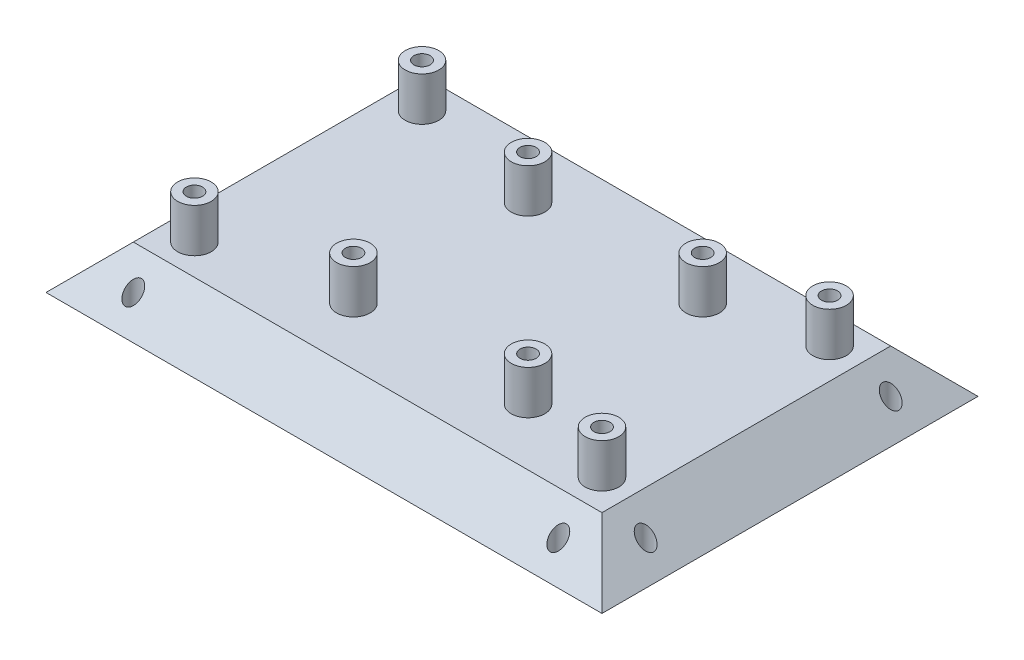
ISO-10303-21;
HEADER;
FILE_DESCRIPTION(('STEP AP214'),'2;1');
FILE_NAME('part.step','',(''),(''),'','','');
FILE_SCHEMA(('AUTOMOTIVE_DESIGN { 1 0 10303 214 1 1 1 1 }'));
ENDSEC;
DATA;
#1=APPLICATION_CONTEXT('core data for automotive mechanical design processes');
#2=APPLICATION_PROTOCOL_DEFINITION('international standard','automotive_design',2000,#1);
#3=PRODUCT_CONTEXT('',#1,'mechanical');
#4=PRODUCT('Part','Part','',(#3));
#5=PRODUCT_RELATED_PRODUCT_CATEGORY('part','',(#4));
#6=PRODUCT_DEFINITION_FORMATION('','',#4);
#7=PRODUCT_DEFINITION_CONTEXT('part definition',#1,'design');
#8=PRODUCT_DEFINITION('design','',#6,#7);
#9=PRODUCT_DEFINITION_SHAPE('','',#8);
#10=(LENGTH_UNIT() NAMED_UNIT(*) SI_UNIT(.MILLI.,.METRE.));
#11=(NAMED_UNIT(*) PLANE_ANGLE_UNIT() SI_UNIT($,.RADIAN.));
#12=(NAMED_UNIT(*) SI_UNIT($,.STERADIAN.) SOLID_ANGLE_UNIT());
#13=UNCERTAINTY_MEASURE_WITH_UNIT(LENGTH_MEASURE(1.E-05),#10,'distance_accuracy_value','');
#14=(GEOMETRIC_REPRESENTATION_CONTEXT(3) GLOBAL_UNCERTAINTY_ASSIGNED_CONTEXT((#13)) GLOBAL_UNIT_ASSIGNED_CONTEXT((#10,
#11,#12)) REPRESENTATION_CONTEXT('',''));
#15=CARTESIAN_POINT('',(0.,0.,0.));
#16=DIRECTION('',(0.,0.,1.));
#17=DIRECTION('',(1.,0.,0.));
#18=AXIS2_PLACEMENT_3D('',#15,#16,#17);
#19=CARTESIAN_POINT('',(0.,10.,0.));
#20=DIRECTION('',(0.,1.,0.));
#21=DIRECTION('',(0.,0.,1.));
#22=AXIS2_PLACEMENT_3D('',#19,#20,#21);
#23=PLANE('',#22);
#24=CARTESIAN_POINT('',(87.3500771700208,10.,63.0627065069762));
#25=DIRECTION('',(0.,1.,0.));
#26=DIRECTION('',(0.,0.,1.));
#27=AXIS2_PLACEMENT_3D('',#24,#25,#26);
#28=CIRCLE('',#27,3.85);
#29=CARTESIAN_POINT('',(87.3500771700208,10.,66.9127065069762));
#30=VERTEX_POINT('',#29);
#31=EDGE_CURVE('E566',#30,#30,#28,.T.);
#32=ORIENTED_EDGE('',*,*,#31,.F.);
#33=EDGE_LOOP('',(#32));
#34=FACE_BOUND('',#33,.T.);
#35=CARTESIAN_POINT('',(47.3500771700211,10.,63.0627065069764));
#36=DIRECTION('',(0.,1.,0.));
#37=DIRECTION('',(0.,0.,1.));
#38=AXIS2_PLACEMENT_3D('',#35,#36,#37);
#39=CIRCLE('',#38,3.85000000000001);
#40=CARTESIAN_POINT('',(47.3500771700211,10.,66.9127065069764));
#41=VERTEX_POINT('',#40);
#42=EDGE_CURVE('E557',#41,#41,#39,.T.);
#43=ORIENTED_EDGE('',*,*,#42,.F.);
#44=EDGE_LOOP('',(#43));
#45=FACE_BOUND('',#44,.T.);
#46=CARTESIAN_POINT('',(47.3500771700211,10.,23.0627065069765));
#47=DIRECTION('',(0.,1.,0.));
#48=DIRECTION('',(0.,0.,1.));
#49=AXIS2_PLACEMENT_3D('',#46,#47,#48);
#50=CIRCLE('',#49,3.85);
#51=CARTESIAN_POINT('',(47.3500771700211,10.,26.9127065069764));
#52=VERTEX_POINT('',#51);
#53=EDGE_CURVE('E548',#52,#52,#50,.T.);
#54=ORIENTED_EDGE('',*,*,#53,.F.);
#55=EDGE_LOOP('',(#54));
#56=FACE_BOUND('',#55,.T.);
#57=CARTESIAN_POINT('',(87.3500771700208,10.,23.0627065069762));
#58=DIRECTION('',(0.,1.,0.));
#59=DIRECTION('',(0.,0.,1.));
#60=AXIS2_PLACEMENT_3D('',#57,#58,#59);
#61=CIRCLE('',#60,3.85);
#62=CARTESIAN_POINT('',(87.3500771700208,10.,26.9127065069762));
#63=VERTEX_POINT('',#62);
#64=EDGE_CURVE('E539',#63,#63,#61,.T.);
#65=ORIENTED_EDGE('',*,*,#64,.F.);
#66=EDGE_LOOP('',(#65));
#67=FACE_BOUND('',#66,.T.);
#68=CARTESIAN_POINT('',(17.,10.,69.1254130139523));
#69=DIRECTION('',(0.,1.,0.));
#70=DIRECTION('',(0.,0.,-1.));
#71=AXIS2_PLACEMENT_3D('',#68,#69,#70);
#72=CIRCLE('',#71,3.85);
#73=CARTESIAN_POINT('',(17.,10.,65.2754130139523));
#74=VERTEX_POINT('',#73);
#75=EDGE_CURVE('E530',#74,#74,#72,.T.);
#76=ORIENTED_EDGE('',*,*,#75,.F.);
#77=EDGE_LOOP('',(#76));
#78=FACE_BOUND('',#77,.T.);
#79=CARTESIAN_POINT('',(17.,10.,17.));
#80=DIRECTION('',(0.,1.,0.));
#81=DIRECTION('',(0.,0.,1.));
#82=AXIS2_PLACEMENT_3D('',#79,#80,#81);
#83=CIRCLE('',#82,3.85);
#84=CARTESIAN_POINT('',(17.,10.,20.85));
#85=VERTEX_POINT('',#84);
#86=EDGE_CURVE('E521',#85,#85,#83,.T.);
#87=ORIENTED_EDGE('',*,*,#86,.F.);
#88=EDGE_LOOP('',(#87));
#89=FACE_BOUND('',#88,.T.);
#90=CARTESIAN_POINT('',(110.350077170021,10.,17.));
#91=DIRECTION('',(0.,1.,0.));
#92=DIRECTION('',(0.,0.,-1.));
#93=AXIS2_PLACEMENT_3D('',#90,#91,#92);
#94=CIRCLE('',#93,3.85);
#95=CARTESIAN_POINT('',(110.350077170021,10.,13.15));
#96=VERTEX_POINT('',#95);
#97=EDGE_CURVE('E512',#96,#96,#94,.T.);
#98=ORIENTED_EDGE('',*,*,#97,.F.);
#99=EDGE_LOOP('',(#98));
#100=FACE_BOUND('',#99,.T.);
#101=CARTESIAN_POINT('',(110.350077170021,10.,69.1254130139523));
#102=DIRECTION('',(0.,1.,0.));
#103=DIRECTION('',(0.,0.,1.));
#104=AXIS2_PLACEMENT_3D('',#101,#102,#103);
#105=CIRCLE('',#104,3.85);
#106=CARTESIAN_POINT('',(110.350077170021,10.,72.9754130139523));
#107=VERTEX_POINT('',#106);
#108=EDGE_CURVE('E503',#107,#107,#105,.T.);
#109=ORIENTED_EDGE('',*,*,#108,.F.);
#110=EDGE_LOOP('',(#109));
#111=FACE_BOUND('',#110,.T.);
#112=DIRECTION('',(-1.,0.,0.));
#113=VECTOR('',#112,1.);
#114=CARTESIAN_POINT('',(117.350077170021,10.,10.));
#115=LINE('',#114,#113);
#116=CARTESIAN_POINT('',(117.350077170021,10.,10.));
#117=VERTEX_POINT('',#116);
#118=CARTESIAN_POINT('',(9.99999999999999,10.,10.));
#119=VERTEX_POINT('',#118);
#120=EDGE_CURVE('E101',#117,#119,#115,.T.);
#121=ORIENTED_EDGE('',*,*,#120,.T.);
#122=DIRECTION('',(0.,0.,1.));
#123=VECTOR('',#122,1.);
#124=CARTESIAN_POINT('',(10.,10.,10.));
#125=LINE('',#124,#123);
#126=CARTESIAN_POINT('',(10.,10.,76.1254130139523));
#127=VERTEX_POINT('',#126);
#128=EDGE_CURVE('E98',#119,#127,#125,.T.);
#129=ORIENTED_EDGE('',*,*,#128,.T.);
#130=DIRECTION('',(1.,0.,0.));
#131=VECTOR('',#130,1.);
#132=CARTESIAN_POINT('',(10.,10.,76.1254130139523));
#133=LINE('',#132,#131);
#134=CARTESIAN_POINT('',(117.350077170021,10.,76.1254130139523));
#135=VERTEX_POINT('',#134);
#136=EDGE_CURVE('E182',#127,#135,#133,.T.);
#137=ORIENTED_EDGE('',*,*,#136,.T.);
#138=DIRECTION('',(0.,0.,-1.));
#139=VECTOR('',#138,1.);
#140=CARTESIAN_POINT('',(117.350077170021,10.,76.1254130139523));
#141=LINE('',#140,#139);
#142=EDGE_CURVE('E60',#135,#117,#141,.T.);
#143=ORIENTED_EDGE('',*,*,#142,.T.);
#144=EDGE_LOOP('',(#121,#129,#137,#143));
#145=FACE_BOUND('',#144,.T.);
#146=ADVANCED_FACE('F45',(#34,#45,#56,#67,#78,#89,#100,#111,#145),#23,.T.);
#147=CARTESIAN_POINT('',(0.,0.,0.));
#148=DIRECTION('',(0.,1.,0.));
#149=DIRECTION('',(0.,0.,1.));
#150=AXIS2_PLACEMENT_3D('',#147,#148,#149);
#151=PLANE('',#150);
#152=CARTESIAN_POINT('',(5.,0.,71.1254130139523));
#153=DIRECTION('',(0.,-1.,0.));
#154=DIRECTION('',(0.,0.,1.));
#155=AXIS2_PLACEMENT_3D('',#152,#153,#154);
#156=CIRCLE('',#155,1.85);
#157=CARTESIAN_POINT('',(5.,0.,72.9754130139523));
#158=VERTEX_POINT('',#157);
#159=EDGE_CURVE('E478',#158,#158,#156,.T.);
#160=ORIENTED_EDGE('',*,*,#159,.F.);
#161=EDGE_LOOP('',(#160));
#162=FACE_BOUND('',#161,.T.);
#163=CARTESIAN_POINT('',(122.350077170021,0.,71.1254130139523));
#164=DIRECTION('',(0.,-1.,0.));
#165=DIRECTION('',(0.,0.,-1.));
#166=AXIS2_PLACEMENT_3D('',#163,#164,#165);
#167=CIRCLE('',#166,1.85000000000001);
#168=CARTESIAN_POINT('',(122.350077170021,0.,69.2754130139522));
#169=VERTEX_POINT('',#168);
#170=EDGE_CURVE('E482',#169,#169,#167,.T.);
#171=ORIENTED_EDGE('',*,*,#170,.F.);
#172=EDGE_LOOP('',(#171));
#173=FACE_BOUND('',#172,.T.);
#174=CARTESIAN_POINT('',(122.350077170021,0.,15.));
#175=DIRECTION('',(0.,-1.,0.));
#176=DIRECTION('',(0.,0.,1.));
#177=AXIS2_PLACEMENT_3D('',#174,#175,#176);
#178=CIRCLE('',#177,1.85);
#179=CARTESIAN_POINT('',(122.350077170021,0.,16.85));
#180=VERTEX_POINT('',#179);
#181=EDGE_CURVE('E488',#180,#180,#178,.T.);
#182=ORIENTED_EDGE('',*,*,#181,.F.);
#183=EDGE_LOOP('',(#182));
#184=FACE_BOUND('',#183,.T.);
#185=CARTESIAN_POINT('',(15.,0.,5.));
#186=DIRECTION('',(0.,-1.,0.));
#187=DIRECTION('',(0.,0.,1.));
#188=AXIS2_PLACEMENT_3D('',#185,#186,#187);
#189=CIRCLE('',#188,1.85);
#190=CARTESIAN_POINT('',(15.,0.,6.85));
#191=VERTEX_POINT('',#190);
#192=EDGE_CURVE('E485',#191,#191,#189,.T.);
#193=ORIENTED_EDGE('',*,*,#192,.F.);
#194=EDGE_LOOP('',(#193));
#195=FACE_BOUND('',#194,.T.);
#196=CARTESIAN_POINT('',(15.,0.,81.1254130139523));
#197=DIRECTION('',(0.,-1.,0.));
#198=DIRECTION('',(0.,0.,-1.));
#199=AXIS2_PLACEMENT_3D('',#196,#197,#198);
#200=CIRCLE('',#199,1.85);
#201=CARTESIAN_POINT('',(15.,0.,79.2754130139523));
#202=VERTEX_POINT('',#201);
#203=EDGE_CURVE('E489',#202,#202,#200,.T.);
#204=ORIENTED_EDGE('',*,*,#203,.F.);
#205=EDGE_LOOP('',(#204));
#206=FACE_BOUND('',#205,.T.);
#207=CARTESIAN_POINT('',(112.350077170021,0.,81.1254130139523));
#208=DIRECTION('',(0.,-1.,0.));
#209=DIRECTION('',(0.,0.,1.));
#210=AXIS2_PLACEMENT_3D('',#207,#208,#209);
#211=CIRCLE('',#210,1.85000000000001);
#212=CARTESIAN_POINT('',(112.350077170021,0.,82.9754130139522));
#213=VERTEX_POINT('',#212);
#214=EDGE_CURVE('E497',#213,#213,#211,.T.);
#215=ORIENTED_EDGE('',*,*,#214,.F.);
#216=EDGE_LOOP('',(#215));
#217=FACE_BOUND('',#216,.T.);
#218=CARTESIAN_POINT('',(112.350077170021,0.,5.));
#219=DIRECTION('',(0.,-1.,0.));
#220=DIRECTION('',(0.,0.,-1.));
#221=AXIS2_PLACEMENT_3D('',#218,#219,#220);
#222=CIRCLE('',#221,1.85);
#223=CARTESIAN_POINT('',(112.350077170021,0.,3.15));
#224=VERTEX_POINT('',#223);
#225=EDGE_CURVE('E494',#224,#224,#222,.T.);
#226=ORIENTED_EDGE('',*,*,#225,.F.);
#227=EDGE_LOOP('',(#226));
#228=FACE_BOUND('',#227,.T.);
#229=CARTESIAN_POINT('',(5.,0.,15.));
#230=DIRECTION('',(0.,-1.,0.));
#231=DIRECTION('',(0.,0.,-1.));
#232=AXIS2_PLACEMENT_3D('',#229,#230,#231);
#233=CIRCLE('',#232,1.85);
#234=CARTESIAN_POINT('',(5.,0.,13.15));
#235=VERTEX_POINT('',#234);
#236=EDGE_CURVE('E431',#235,#235,#233,.T.);
#237=ORIENTED_EDGE('',*,*,#236,.F.);
#238=EDGE_LOOP('',(#237));
#239=FACE_BOUND('',#238,.T.);
#240=DIRECTION('',(0.,0.,1.));
#241=VECTOR('',#240,1.);
#242=CARTESIAN_POINT('',(0.,0.,0.));
#243=LINE('',#242,#241);
#244=CARTESIAN_POINT('',(0.,0.,0.));
#245=VERTEX_POINT('',#244);
#246=CARTESIAN_POINT('',(0.,0.,86.1254130139523));
#247=VERTEX_POINT('',#246);
#248=EDGE_CURVE('E94',#245,#247,#243,.T.);
#249=ORIENTED_EDGE('',*,*,#248,.F.);
#250=DIRECTION('',(-1.,0.,0.));
#251=VECTOR('',#250,1.);
#252=CARTESIAN_POINT('',(0.,0.,0.));
#253=LINE('',#252,#251);
#254=CARTESIAN_POINT('',(127.350077170021,0.,0.));
#255=VERTEX_POINT('',#254);
#256=EDGE_CURVE('E105',#255,#245,#253,.T.);
#257=ORIENTED_EDGE('',*,*,#256,.F.);
#258=DIRECTION('',(0.,0.,-1.));
#259=VECTOR('',#258,1.);
#260=CARTESIAN_POINT('',(127.350077170021,0.,0.));
#261=LINE('',#260,#259);
#262=CARTESIAN_POINT('',(127.350077170021,0.,86.1254130139523));
#263=VERTEX_POINT('',#262);
#264=EDGE_CURVE('E112',#263,#255,#261,.T.);
#265=ORIENTED_EDGE('',*,*,#264,.F.);
#266=DIRECTION('',(1.,0.,0.));
#267=VECTOR('',#266,1.);
#268=CARTESIAN_POINT('',(0.,0.,86.1254130139523));
#269=LINE('',#268,#267);
#270=EDGE_CURVE('E118',#247,#263,#269,.T.);
#271=ORIENTED_EDGE('',*,*,#270,.F.);
#272=EDGE_LOOP('',(#249,#257,#265,#271));
#273=FACE_BOUND('',#272,.T.);
#274=ADVANCED_FACE('F117',(#162,#173,#184,#195,#206,#217,#228,#239,#273),#151,.F.);
#275=CARTESIAN_POINT('',(0.,43.0627065069762,43.0627065069762));
#276=DIRECTION('',(0.,-0.707106781186547,-0.707106781186548));
#277=DIRECTION('',(0.,0.707106781186548,-0.707106781186547));
#278=AXIS2_PLACEMENT_3D('',#275,#276,#277);
#279=PLANE('',#278);
#280=CARTESIAN_POINT('',(15.,5.00000000000005,81.1254130139523));
#281=DIRECTION('',(0.,-0.707106781186547,-0.707106781186548));
#282=DIRECTION('',(0.,-0.707106781186548,0.707106781186547));
#283=AXIS2_PLACEMENT_3D('',#280,#281,#282);
#284=ELLIPSE('',#283,2.61629509039023,1.85);
#285=CARTESIAN_POINT('',(15.,3.15000000000005,82.9754130139523));
#286=VERTEX_POINT('',#285);
#287=EDGE_CURVE('E120',#286,#286,#284,.T.);
#288=ORIENTED_EDGE('',*,*,#287,.T.);
#289=EDGE_LOOP('',(#288));
#290=FACE_BOUND('',#289,.T.);
#291=CARTESIAN_POINT('',(112.350077170021,5.0000000000001,81.1254130139523));
#292=DIRECTION('',(0.,-0.707106781186547,-0.707106781186548));
#293=DIRECTION('',(0.,-0.707106781186548,0.707106781186547));
#294=AXIS2_PLACEMENT_3D('',#291,#292,#293);
#295=ELLIPSE('',#294,2.61629509039023,1.85000000000001);
#296=CARTESIAN_POINT('',(112.350077170021,3.1500000000001,82.9754130139522));
#297=VERTEX_POINT('',#296);
#298=EDGE_CURVE('E411',#297,#297,#295,.T.);
#299=ORIENTED_EDGE('',*,*,#298,.T.);
#300=EDGE_LOOP('',(#299));
#301=FACE_BOUND('',#300,.T.);
#302=DIRECTION('',(-0.577350269189626,0.577350269189626,-0.577350269189626));
#303=VECTOR('',#302,1.);
#304=CARTESIAN_POINT('',(127.350077170021,0.,86.1254130139523));
#305=LINE('',#304,#303);
#306=EDGE_CURVE('E69',#263,#135,#305,.T.);
#307=ORIENTED_EDGE('',*,*,#306,.T.);
#308=ORIENTED_EDGE('',*,*,#136,.F.);
#309=DIRECTION('',(0.577350269189626,0.577350269189626,-0.577350269189626));
#310=VECTOR('',#309,1.);
#311=CARTESIAN_POINT('',(0.,0.,86.1254130139523));
#312=LINE('',#311,#310);
#313=EDGE_CURVE('E203',#247,#127,#312,.T.);
#314=ORIENTED_EDGE('',*,*,#313,.F.);
#315=ORIENTED_EDGE('',*,*,#270,.T.);
#316=EDGE_LOOP('',(#307,#308,#314,#315));
#317=FACE_BOUND('',#316,.T.);
#318=ADVANCED_FACE('F141',(#290,#301,#317),#279,.F.);
#319=CARTESIAN_POINT('',(0.,0.,0.));
#320=DIRECTION('',(0.707106781186547,-0.707106781186547,0.));
#321=DIRECTION('',(0.707106781186548,0.707106781186548,0.));
#322=AXIS2_PLACEMENT_3D('',#319,#320,#321);
#323=PLANE('',#322);
#324=CARTESIAN_POINT('',(5.,5.,71.1254130139523));
#325=DIRECTION('',(0.707106781186547,-0.707106781186547,0.));
#326=DIRECTION('',(-0.707106781186548,-0.707106781186548,0.));
#327=AXIS2_PLACEMENT_3D('',#324,#325,#326);
#328=ELLIPSE('',#327,2.61629509039023,1.85);
#329=CARTESIAN_POINT('',(3.15,3.15,71.1254130139523));
#330=VERTEX_POINT('',#329);
#331=EDGE_CURVE('E414',#330,#330,#328,.T.);
#332=ORIENTED_EDGE('',*,*,#331,.T.);
#333=EDGE_LOOP('',(#332));
#334=FACE_BOUND('',#333,.T.);
#335=CARTESIAN_POINT('',(5.,5.,15.));
#336=DIRECTION('',(0.707106781186547,-0.707106781186547,0.));
#337=DIRECTION('',(-0.707106781186548,-0.707106781186548,0.));
#338=AXIS2_PLACEMENT_3D('',#335,#336,#337);
#339=ELLIPSE('',#338,2.61629509039023,1.85);
#340=CARTESIAN_POINT('',(3.15,3.15,15.));
#341=VERTEX_POINT('',#340);
#342=EDGE_CURVE('E417',#341,#341,#339,.T.);
#343=ORIENTED_EDGE('',*,*,#342,.T.);
#344=EDGE_LOOP('',(#343));
#345=FACE_BOUND('',#344,.T.);
#346=ORIENTED_EDGE('',*,*,#313,.T.);
#347=ORIENTED_EDGE('',*,*,#128,.F.);
#348=DIRECTION('',(0.577350269189626,0.577350269189626,0.577350269189626));
#349=VECTOR('',#348,1.);
#350=CARTESIAN_POINT('',(0.,0.,0.));
#351=LINE('',#350,#349);
#352=EDGE_CURVE('E89',#245,#119,#351,.T.);
#353=ORIENTED_EDGE('',*,*,#352,.F.);
#354=ORIENTED_EDGE('',*,*,#248,.T.);
#355=EDGE_LOOP('',(#346,#347,#353,#354));
#356=FACE_BOUND('',#355,.T.);
#357=ADVANCED_FACE('F92',(#334,#345,#356),#323,.F.);
#358=CARTESIAN_POINT('',(63.6750385850105,63.6750385850105,0.));
#359=DIRECTION('',(-0.707106781186548,-0.707106781186547,0.));
#360=DIRECTION('',(0.707106781186547,-0.707106781186548,0.));
#361=AXIS2_PLACEMENT_3D('',#358,#359,#360);
#362=PLANE('',#361);
#363=CARTESIAN_POINT('',(122.350077170021,5.00000000000001,71.1254130139523));
#364=DIRECTION('',(-0.707106781186548,-0.707106781186547,0.));
#365=DIRECTION('',(0.707106781186547,-0.707106781186548,0.));
#366=AXIS2_PLACEMENT_3D('',#363,#364,#365);
#367=ELLIPSE('',#366,2.61629509039023,1.85000000000001);
#368=CARTESIAN_POINT('',(124.200077170021,3.15,71.1254130139523));
#369=VERTEX_POINT('',#368);
#370=EDGE_CURVE('E420',#369,#369,#367,.T.);
#371=ORIENTED_EDGE('',*,*,#370,.T.);
#372=EDGE_LOOP('',(#371));
#373=FACE_BOUND('',#372,.T.);
#374=CARTESIAN_POINT('',(122.350077170021,5.00000000000001,15.));
#375=DIRECTION('',(-0.707106781186548,-0.707106781186547,0.));
#376=DIRECTION('',(0.707106781186547,-0.707106781186548,0.));
#377=AXIS2_PLACEMENT_3D('',#374,#375,#376);
#378=ELLIPSE('',#377,2.61629509039023,1.85);
#379=CARTESIAN_POINT('',(124.200077170021,3.15,15.));
#380=VERTEX_POINT('',#379);
#381=EDGE_CURVE('E422',#380,#380,#378,.T.);
#382=ORIENTED_EDGE('',*,*,#381,.T.);
#383=EDGE_LOOP('',(#382));
#384=FACE_BOUND('',#383,.T.);
#385=DIRECTION('',(-0.577350269189626,0.577350269189626,0.577350269189626));
#386=VECTOR('',#385,1.);
#387=CARTESIAN_POINT('',(127.350077170021,0.,0.));
#388=LINE('',#387,#386);
#389=EDGE_CURVE('E102',#255,#117,#388,.T.);
#390=ORIENTED_EDGE('',*,*,#389,.T.);
#391=ORIENTED_EDGE('',*,*,#142,.F.);
#392=ORIENTED_EDGE('',*,*,#306,.F.);
#393=ORIENTED_EDGE('',*,*,#264,.T.);
#394=EDGE_LOOP('',(#390,#391,#392,#393));
#395=FACE_BOUND('',#394,.T.);
#396=ADVANCED_FACE('F194',(#373,#384,#395),#362,.F.);
#397=CARTESIAN_POINT('',(0.,0.,0.));
#398=DIRECTION('',(0.,-0.707106781186547,0.707106781186547));
#399=DIRECTION('',(0.,-0.707106781186548,-0.707106781186548));
#400=AXIS2_PLACEMENT_3D('',#397,#398,#399);
#401=PLANE('',#400);
#402=CARTESIAN_POINT('',(15.,5.,5.));
#403=DIRECTION('',(0.,-0.707106781186547,0.707106781186547));
#404=DIRECTION('',(0.,-0.707106781186548,-0.707106781186548));
#405=AXIS2_PLACEMENT_3D('',#402,#403,#404);
#406=ELLIPSE('',#405,2.61629509039023,1.85);
#407=CARTESIAN_POINT('',(15.,3.15,3.15));
#408=VERTEX_POINT('',#407);
#409=EDGE_CURVE('E425',#408,#408,#406,.T.);
#410=ORIENTED_EDGE('',*,*,#409,.T.);
#411=EDGE_LOOP('',(#410));
#412=FACE_BOUND('',#411,.T.);
#413=CARTESIAN_POINT('',(112.350077170021,5.,5.));
#414=DIRECTION('',(0.,-0.707106781186547,0.707106781186547));
#415=DIRECTION('',(0.,-0.707106781186548,-0.707106781186548));
#416=AXIS2_PLACEMENT_3D('',#413,#414,#415);
#417=ELLIPSE('',#416,2.61629509039023,1.85);
#418=CARTESIAN_POINT('',(112.350077170021,3.15,3.15));
#419=VERTEX_POINT('',#418);
#420=EDGE_CURVE('E428',#419,#419,#417,.T.);
#421=ORIENTED_EDGE('',*,*,#420,.T.);
#422=EDGE_LOOP('',(#421));
#423=FACE_BOUND('',#422,.T.);
#424=ORIENTED_EDGE('',*,*,#352,.T.);
#425=ORIENTED_EDGE('',*,*,#120,.F.);
#426=ORIENTED_EDGE('',*,*,#389,.F.);
#427=ORIENTED_EDGE('',*,*,#256,.T.);
#428=EDGE_LOOP('',(#424,#425,#426,#427));
#429=FACE_BOUND('',#428,.T.);
#430=ADVANCED_FACE('F107',(#412,#423,#429),#401,.F.);
#431=CARTESIAN_POINT('',(112.350077170021,10.0001,5.));
#432=DIRECTION('',(0.,-1.,0.));
#433=DIRECTION('',(0.,0.,-1.));
#434=AXIS2_PLACEMENT_3D('',#431,#432,#433);
#435=CYLINDRICAL_SURFACE('',#434,1.85);
#436=ORIENTED_EDGE('',*,*,#225,.T.);
#437=EDGE_LOOP('',(#436));
#438=FACE_BOUND('',#437,.T.);
#439=ORIENTED_EDGE('',*,*,#420,.F.);
#440=EDGE_LOOP('',(#439));
#441=FACE_BOUND('',#440,.T.);
#442=ADVANCED_FACE('F252',(#438,#441),#435,.F.);
#443=CARTESIAN_POINT('',(15.,10.0001,5.));
#444=DIRECTION('',(0.,-1.,0.));
#445=DIRECTION('',(0.,0.,-1.));
#446=AXIS2_PLACEMENT_3D('',#443,#444,#445);
#447=CYLINDRICAL_SURFACE('',#446,1.85);
#448=ORIENTED_EDGE('',*,*,#192,.T.);
#449=EDGE_LOOP('',(#448));
#450=FACE_BOUND('',#449,.T.);
#451=ORIENTED_EDGE('',*,*,#409,.F.);
#452=EDGE_LOOP('',(#451));
#453=FACE_BOUND('',#452,.T.);
#454=ADVANCED_FACE('F622',(#450,#453),#447,.F.);
#455=CARTESIAN_POINT('',(122.350077170021,10.0001,15.));
#456=DIRECTION('',(0.,-1.,0.));
#457=DIRECTION('',(0.,0.,-1.));
#458=AXIS2_PLACEMENT_3D('',#455,#456,#457);
#459=CYLINDRICAL_SURFACE('',#458,1.85);
#460=ORIENTED_EDGE('',*,*,#181,.T.);
#461=EDGE_LOOP('',(#460));
#462=FACE_BOUND('',#461,.T.);
#463=ORIENTED_EDGE('',*,*,#381,.F.);
#464=EDGE_LOOP('',(#463));
#465=FACE_BOUND('',#464,.T.);
#466=ADVANCED_FACE('F630',(#462,#465),#459,.F.);
#467=CARTESIAN_POINT('',(122.350077170021,10.0001,71.1254130139523));
#468=DIRECTION('',(0.,-1.,0.));
#469=DIRECTION('',(0.,0.,-1.));
#470=AXIS2_PLACEMENT_3D('',#467,#468,#469);
#471=CYLINDRICAL_SURFACE('',#470,1.85000000000001);
#472=ORIENTED_EDGE('',*,*,#170,.T.);
#473=EDGE_LOOP('',(#472));
#474=FACE_BOUND('',#473,.T.);
#475=ORIENTED_EDGE('',*,*,#370,.F.);
#476=EDGE_LOOP('',(#475));
#477=FACE_BOUND('',#476,.T.);
#478=ADVANCED_FACE('F627',(#474,#477),#471,.F.);
#479=CARTESIAN_POINT('',(5.,10.0001,15.));
#480=DIRECTION('',(0.,-1.,0.));
#481=DIRECTION('',(0.,0.,-1.));
#482=AXIS2_PLACEMENT_3D('',#479,#480,#481);
#483=CYLINDRICAL_SURFACE('',#482,1.85);
#484=ORIENTED_EDGE('',*,*,#236,.T.);
#485=EDGE_LOOP('',(#484));
#486=FACE_BOUND('',#485,.T.);
#487=ORIENTED_EDGE('',*,*,#342,.F.);
#488=EDGE_LOOP('',(#487));
#489=FACE_BOUND('',#488,.T.);
#490=ADVANCED_FACE('F143',(#486,#489),#483,.F.);
#491=CARTESIAN_POINT('',(5.,10.0001,71.1254130139523));
#492=DIRECTION('',(0.,-1.,0.));
#493=DIRECTION('',(0.,0.,-1.));
#494=AXIS2_PLACEMENT_3D('',#491,#492,#493);
#495=CYLINDRICAL_SURFACE('',#494,1.85);
#496=ORIENTED_EDGE('',*,*,#159,.T.);
#497=EDGE_LOOP('',(#496));
#498=FACE_BOUND('',#497,.T.);
#499=ORIENTED_EDGE('',*,*,#331,.F.);
#500=EDGE_LOOP('',(#499));
#501=FACE_BOUND('',#500,.T.);
#502=ADVANCED_FACE('F618',(#498,#501),#495,.F.);
#503=CARTESIAN_POINT('',(112.350077170021,10.0001,81.1254130139523));
#504=DIRECTION('',(0.,-1.,0.));
#505=DIRECTION('',(0.,0.,-1.));
#506=AXIS2_PLACEMENT_3D('',#503,#504,#505);
#507=CYLINDRICAL_SURFACE('',#506,1.85000000000001);
#508=ORIENTED_EDGE('',*,*,#214,.T.);
#509=EDGE_LOOP('',(#508));
#510=FACE_BOUND('',#509,.T.);
#511=ORIENTED_EDGE('',*,*,#298,.F.);
#512=EDGE_LOOP('',(#511));
#513=FACE_BOUND('',#512,.T.);
#514=ADVANCED_FACE('F614',(#510,#513),#507,.F.);
#515=CARTESIAN_POINT('',(15.,10.0001,81.1254130139523));
#516=DIRECTION('',(0.,-1.,0.));
#517=DIRECTION('',(0.,0.,-1.));
#518=AXIS2_PLACEMENT_3D('',#515,#516,#517);
#519=CYLINDRICAL_SURFACE('',#518,1.85);
#520=ORIENTED_EDGE('',*,*,#203,.T.);
#521=EDGE_LOOP('',(#520));
#522=FACE_BOUND('',#521,.T.);
#523=ORIENTED_EDGE('',*,*,#287,.F.);
#524=EDGE_LOOP('',(#523));
#525=FACE_BOUND('',#524,.T.);
#526=ADVANCED_FACE('F607',(#522,#525),#519,.F.);
#527=CARTESIAN_POINT('',(110.350077170021,20.,69.1254130139523));
#528=DIRECTION('',(0.,1.,0.));
#529=DIRECTION('',(0.,0.,1.));
#530=AXIS2_PLACEMENT_3D('',#527,#528,#529);
#531=PLANE('',#530);
#532=CARTESIAN_POINT('',(110.350077170021,20.,69.1254130139523));
#533=DIRECTION('',(0.,1.,0.));
#534=DIRECTION('',(0.,0.,1.));
#535=AXIS2_PLACEMENT_3D('',#532,#533,#534);
#536=CIRCLE('',#535,3.85);
#537=CARTESIAN_POINT('',(110.350077170021,20.,72.9754130139523));
#538=VERTEX_POINT('',#537);
#539=EDGE_CURVE('E498',#538,#538,#536,.T.);
#540=ORIENTED_EDGE('',*,*,#539,.T.);
#541=EDGE_LOOP('',(#540));
#542=FACE_BOUND('',#541,.T.);
#543=CARTESIAN_POINT('',(110.350077170021,20.,69.1254130139523));
#544=DIRECTION('',(0.,1.,0.));
#545=DIRECTION('',(0.,0.,1.));
#546=AXIS2_PLACEMENT_3D('',#543,#544,#545);
#547=CIRCLE('',#546,1.85000000000001);
#548=CARTESIAN_POINT('',(110.350077170021,20.,70.9754130139523));
#549=VERTEX_POINT('',#548);
#550=EDGE_CURVE('E506',#549,#549,#547,.T.);
#551=ORIENTED_EDGE('',*,*,#550,.F.);
#552=EDGE_LOOP('',(#551));
#553=FACE_BOUND('',#552,.T.);
#554=ADVANCED_FACE('F604',(#542,#553),#531,.T.);
#555=CARTESIAN_POINT('',(110.350077170021,20.,69.1254130139523));
#556=DIRECTION('',(0.,-1.,0.));
#557=DIRECTION('',(0.,0.,-1.));
#558=AXIS2_PLACEMENT_3D('',#555,#556,#557);
#559=CYLINDRICAL_SURFACE('',#558,3.85);
#560=ORIENTED_EDGE('',*,*,#539,.F.);
#561=EDGE_LOOP('',(#560));
#562=FACE_BOUND('',#561,.T.);
#563=ORIENTED_EDGE('',*,*,#108,.T.);
#564=EDGE_LOOP('',(#563));
#565=FACE_BOUND('',#564,.T.);
#566=ADVANCED_FACE('F296',(#562,#565),#559,.T.);
#567=CARTESIAN_POINT('',(110.350077170021,20.,69.1254130139523));
#568=DIRECTION('',(0.,-1.,0.));
#569=DIRECTION('',(0.,0.,-1.));
#570=AXIS2_PLACEMENT_3D('',#567,#568,#569);
#571=CYLINDRICAL_SURFACE('',#570,1.85000000000001);
#572=ORIENTED_EDGE('',*,*,#550,.T.);
#573=EDGE_LOOP('',(#572));
#574=FACE_BOUND('',#573,.T.);
#575=CARTESIAN_POINT('',(110.350077170021,10.,69.1254130139523));
#576=DIRECTION('',(0.,1.,0.));
#577=DIRECTION('',(0.,0.,1.));
#578=AXIS2_PLACEMENT_3D('',#575,#576,#577);
#579=CIRCLE('',#578,1.85000000000001);
#580=CARTESIAN_POINT('',(110.350077170021,10.,70.9754130139523));
#581=VERTEX_POINT('',#580);
#582=EDGE_CURVE('E406',#581,#581,#579,.F.);
#583=ORIENTED_EDGE('',*,*,#582,.T.);
#584=EDGE_LOOP('',(#583));
#585=FACE_BOUND('',#584,.T.);
#586=ADVANCED_FACE('F286',(#574,#585),#571,.F.);
#587=ORIENTED_EDGE('',*,*,#582,.F.);
#588=EDGE_LOOP('',(#587));
#589=FACE_BOUND('',#588,.T.);
#590=ADVANCED_FACE('F275',(#589),#23,.T.);
#591=CARTESIAN_POINT('',(110.350077170021,20.,17.));
#592=DIRECTION('',(0.,-1.,0.));
#593=DIRECTION('',(0.,0.,-1.));
#594=AXIS2_PLACEMENT_3D('',#591,#592,#593);
#595=PLANE('',#594);
#596=CARTESIAN_POINT('',(110.350077170021,20.,17.));
#597=DIRECTION('',(0.,1.,0.));
#598=DIRECTION('',(0.,0.,-1.));
#599=AXIS2_PLACEMENT_3D('',#596,#597,#598);
#600=CIRCLE('',#599,3.85);
#601=CARTESIAN_POINT('',(110.350077170021,20.,13.15));
#602=VERTEX_POINT('',#601);
#603=EDGE_CURVE('E511',#602,#602,#600,.T.);
#604=ORIENTED_EDGE('',*,*,#603,.T.);
#605=EDGE_LOOP('',(#604));
#606=FACE_BOUND('',#605,.T.);
#607=CARTESIAN_POINT('',(110.350077170021,20.,17.));
#608=DIRECTION('',(0.,1.,0.));
#609=DIRECTION('',(0.,0.,-1.));
#610=AXIS2_PLACEMENT_3D('',#607,#608,#609);
#611=CIRCLE('',#610,1.85);
#612=CARTESIAN_POINT('',(110.350077170021,20.,15.15));
#613=VERTEX_POINT('',#612);
#614=EDGE_CURVE('E515',#613,#613,#611,.T.);
#615=ORIENTED_EDGE('',*,*,#614,.F.);
#616=EDGE_LOOP('',(#615));
#617=FACE_BOUND('',#616,.T.);
#618=ADVANCED_FACE('F285',(#606,#617),#595,.F.);
#619=CARTESIAN_POINT('',(110.350077170021,20.,17.));
#620=DIRECTION('',(0.,-1.,0.));
#621=DIRECTION('',(0.,0.,-1.));
#622=AXIS2_PLACEMENT_3D('',#619,#620,#621);
#623=CYLINDRICAL_SURFACE('',#622,3.85);
#624=ORIENTED_EDGE('',*,*,#603,.F.);
#625=EDGE_LOOP('',(#624));
#626=FACE_BOUND('',#625,.T.);
#627=ORIENTED_EDGE('',*,*,#97,.T.);
#628=EDGE_LOOP('',(#627));
#629=FACE_BOUND('',#628,.T.);
#630=ADVANCED_FACE('F293',(#626,#629),#623,.T.);
#631=CARTESIAN_POINT('',(110.350077170021,20.,17.));
#632=DIRECTION('',(0.,-1.,0.));
#633=DIRECTION('',(0.,0.,-1.));
#634=AXIS2_PLACEMENT_3D('',#631,#632,#633);
#635=CYLINDRICAL_SURFACE('',#634,1.85);
#636=ORIENTED_EDGE('',*,*,#614,.T.);
#637=EDGE_LOOP('',(#636));
#638=FACE_BOUND('',#637,.T.);
#639=CARTESIAN_POINT('',(110.350077170021,10.,17.));
#640=DIRECTION('',(0.,1.,0.));
#641=DIRECTION('',(0.,0.,1.));
#642=AXIS2_PLACEMENT_3D('',#639,#640,#641);
#643=CIRCLE('',#642,1.85);
#644=CARTESIAN_POINT('',(110.350077170021,10.,18.85));
#645=VERTEX_POINT('',#644);
#646=EDGE_CURVE('E403',#645,#645,#643,.F.);
#647=ORIENTED_EDGE('',*,*,#646,.T.);
#648=EDGE_LOOP('',(#647));
#649=FACE_BOUND('',#648,.T.);
#650=ADVANCED_FACE('F302',(#638,#649),#635,.F.);
#651=ORIENTED_EDGE('',*,*,#646,.F.);
#652=EDGE_LOOP('',(#651));
#653=FACE_BOUND('',#652,.T.);
#654=ADVANCED_FACE('F288',(#653),#23,.T.);
#655=CARTESIAN_POINT('',(17.,20.,17.));
#656=DIRECTION('',(0.,1.,0.));
#657=DIRECTION('',(0.,0.,1.));
#658=AXIS2_PLACEMENT_3D('',#655,#656,#657);
#659=PLANE('',#658);
#660=CARTESIAN_POINT('',(17.,20.,17.));
#661=DIRECTION('',(0.,1.,0.));
#662=DIRECTION('',(0.,0.,1.));
#663=AXIS2_PLACEMENT_3D('',#660,#661,#662);
#664=CIRCLE('',#663,3.85);
#665=CARTESIAN_POINT('',(17.,20.,20.85));
#666=VERTEX_POINT('',#665);
#667=EDGE_CURVE('E520',#666,#666,#664,.T.);
#668=ORIENTED_EDGE('',*,*,#667,.T.);
#669=EDGE_LOOP('',(#668));
#670=FACE_BOUND('',#669,.T.);
#671=CARTESIAN_POINT('',(17.,20.,17.));
#672=DIRECTION('',(0.,1.,0.));
#673=DIRECTION('',(0.,0.,1.));
#674=AXIS2_PLACEMENT_3D('',#671,#672,#673);
#675=CIRCLE('',#674,1.85);
#676=CARTESIAN_POINT('',(17.,20.,18.85));
#677=VERTEX_POINT('',#676);
#678=EDGE_CURVE('E524',#677,#677,#675,.T.);
#679=ORIENTED_EDGE('',*,*,#678,.F.);
#680=EDGE_LOOP('',(#679));
#681=FACE_BOUND('',#680,.T.);
#682=ADVANCED_FACE('F301',(#670,#681),#659,.T.);
#683=CARTESIAN_POINT('',(17.,20.,17.));
#684=DIRECTION('',(0.,-1.,0.));
#685=DIRECTION('',(0.,0.,-1.));
#686=AXIS2_PLACEMENT_3D('',#683,#684,#685);
#687=CYLINDRICAL_SURFACE('',#686,3.85);
#688=ORIENTED_EDGE('',*,*,#667,.F.);
#689=EDGE_LOOP('',(#688));
#690=FACE_BOUND('',#689,.T.);
#691=ORIENTED_EDGE('',*,*,#86,.T.);
#692=EDGE_LOOP('',(#691));
#693=FACE_BOUND('',#692,.T.);
#694=ADVANCED_FACE('F309',(#690,#693),#687,.T.);
#695=CARTESIAN_POINT('',(17.,20.,17.));
#696=DIRECTION('',(0.,-1.,0.));
#697=DIRECTION('',(0.,0.,-1.));
#698=AXIS2_PLACEMENT_3D('',#695,#696,#697);
#699=CYLINDRICAL_SURFACE('',#698,1.85);
#700=ORIENTED_EDGE('',*,*,#678,.T.);
#701=EDGE_LOOP('',(#700));
#702=FACE_BOUND('',#701,.T.);
#703=CARTESIAN_POINT('',(17.,10.,17.));
#704=DIRECTION('',(0.,1.,0.));
#705=DIRECTION('',(0.,0.,1.));
#706=AXIS2_PLACEMENT_3D('',#703,#704,#705);
#707=CIRCLE('',#706,1.85);
#708=CARTESIAN_POINT('',(17.,10.,18.85));
#709=VERTEX_POINT('',#708);
#710=EDGE_CURVE('E400',#709,#709,#707,.F.);
#711=ORIENTED_EDGE('',*,*,#710,.T.);
#712=EDGE_LOOP('',(#711));
#713=FACE_BOUND('',#712,.T.);
#714=ADVANCED_FACE('F317',(#702,#713),#699,.F.);
#715=ORIENTED_EDGE('',*,*,#710,.F.);
#716=EDGE_LOOP('',(#715));
#717=FACE_BOUND('',#716,.T.);
#718=ADVANCED_FACE('F304',(#717),#23,.T.);
#719=CARTESIAN_POINT('',(17.,20.,69.1254130139523));
#720=DIRECTION('',(0.,-1.,0.));
#721=DIRECTION('',(0.,0.,-1.));
#722=AXIS2_PLACEMENT_3D('',#719,#720,#721);
#723=PLANE('',#722);
#724=CARTESIAN_POINT('',(17.,20.,69.1254130139523));
#725=DIRECTION('',(0.,1.,0.));
#726=DIRECTION('',(0.,0.,-1.));
#727=AXIS2_PLACEMENT_3D('',#724,#725,#726);
#728=CIRCLE('',#727,3.85);
#729=CARTESIAN_POINT('',(17.,20.,65.2754130139523));
#730=VERTEX_POINT('',#729);
#731=EDGE_CURVE('E529',#730,#730,#728,.T.);
#732=ORIENTED_EDGE('',*,*,#731,.T.);
#733=EDGE_LOOP('',(#732));
#734=FACE_BOUND('',#733,.T.);
#735=CARTESIAN_POINT('',(17.,20.,69.1254130139523));
#736=DIRECTION('',(0.,1.,0.));
#737=DIRECTION('',(0.,0.,-1.));
#738=AXIS2_PLACEMENT_3D('',#735,#736,#737);
#739=CIRCLE('',#738,1.85);
#740=CARTESIAN_POINT('',(17.,20.,67.2754130139523));
#741=VERTEX_POINT('',#740);
#742=EDGE_CURVE('E533',#741,#741,#739,.T.);
#743=ORIENTED_EDGE('',*,*,#742,.F.);
#744=EDGE_LOOP('',(#743));
#745=FACE_BOUND('',#744,.T.);
#746=ADVANCED_FACE('F316',(#734,#745),#723,.F.);
#747=CARTESIAN_POINT('',(17.,20.,69.1254130139523));
#748=DIRECTION('',(0.,-1.,0.));
#749=DIRECTION('',(0.,0.,-1.));
#750=AXIS2_PLACEMENT_3D('',#747,#748,#749);
#751=CYLINDRICAL_SURFACE('',#750,3.85);
#752=ORIENTED_EDGE('',*,*,#731,.F.);
#753=EDGE_LOOP('',(#752));
#754=FACE_BOUND('',#753,.T.);
#755=ORIENTED_EDGE('',*,*,#75,.T.);
#756=EDGE_LOOP('',(#755));
#757=FACE_BOUND('',#756,.T.);
#758=ADVANCED_FACE('F324',(#754,#757),#751,.T.);
#759=CARTESIAN_POINT('',(17.,20.,69.1254130139523));
#760=DIRECTION('',(0.,-1.,0.));
#761=DIRECTION('',(0.,0.,-1.));
#762=AXIS2_PLACEMENT_3D('',#759,#760,#761);
#763=CYLINDRICAL_SURFACE('',#762,1.85);
#764=ORIENTED_EDGE('',*,*,#742,.T.);
#765=EDGE_LOOP('',(#764));
#766=FACE_BOUND('',#765,.T.);
#767=CARTESIAN_POINT('',(17.,10.,69.1254130139523));
#768=DIRECTION('',(0.,1.,0.));
#769=DIRECTION('',(0.,0.,1.));
#770=AXIS2_PLACEMENT_3D('',#767,#768,#769);
#771=CIRCLE('',#770,1.85);
#772=CARTESIAN_POINT('',(17.,10.,70.9754130139523));
#773=VERTEX_POINT('',#772);
#774=EDGE_CURVE('E397',#773,#773,#771,.F.);
#775=ORIENTED_EDGE('',*,*,#774,.T.);
#776=EDGE_LOOP('',(#775));
#777=FACE_BOUND('',#776,.T.);
#778=ADVANCED_FACE('F332',(#766,#777),#763,.F.);
#779=ORIENTED_EDGE('',*,*,#774,.F.);
#780=EDGE_LOOP('',(#779));
#781=FACE_BOUND('',#780,.T.);
#782=ADVANCED_FACE('F319',(#781),#23,.T.);
#783=CARTESIAN_POINT('',(87.3500771700208,20.,23.0627065069762));
#784=DIRECTION('',(0.,1.,0.));
#785=DIRECTION('',(0.,0.,1.));
#786=AXIS2_PLACEMENT_3D('',#783,#784,#785);
#787=PLANE('',#786);
#788=CARTESIAN_POINT('',(87.3500771700208,20.,23.0627065069762));
#789=DIRECTION('',(0.,1.,0.));
#790=DIRECTION('',(0.,0.,1.));
#791=AXIS2_PLACEMENT_3D('',#788,#789,#790);
#792=CIRCLE('',#791,3.85);
#793=CARTESIAN_POINT('',(87.3500771700208,20.,26.9127065069762));
#794=VERTEX_POINT('',#793);
#795=EDGE_CURVE('E538',#794,#794,#792,.T.);
#796=ORIENTED_EDGE('',*,*,#795,.T.);
#797=EDGE_LOOP('',(#796));
#798=FACE_BOUND('',#797,.T.);
#799=CARTESIAN_POINT('',(87.3500771700208,20.,23.0627065069762));
#800=DIRECTION('',(0.,1.,0.));
#801=DIRECTION('',(0.,0.,1.));
#802=AXIS2_PLACEMENT_3D('',#799,#800,#801);
#803=CIRCLE('',#802,1.85);
#804=CARTESIAN_POINT('',(87.3500771700208,20.,24.9127065069762));
#805=VERTEX_POINT('',#804);
#806=EDGE_CURVE('E542',#805,#805,#803,.T.);
#807=ORIENTED_EDGE('',*,*,#806,.F.);
#808=EDGE_LOOP('',(#807));
#809=FACE_BOUND('',#808,.T.);
#810=ADVANCED_FACE('F331',(#798,#809),#787,.T.);
#811=CARTESIAN_POINT('',(87.3500771700208,20.,23.0627065069762));
#812=DIRECTION('',(0.,-1.,0.));
#813=DIRECTION('',(0.,0.,-1.));
#814=AXIS2_PLACEMENT_3D('',#811,#812,#813);
#815=CYLINDRICAL_SURFACE('',#814,3.85);
#816=ORIENTED_EDGE('',*,*,#795,.F.);
#817=EDGE_LOOP('',(#816));
#818=FACE_BOUND('',#817,.T.);
#819=ORIENTED_EDGE('',*,*,#64,.T.);
#820=EDGE_LOOP('',(#819));
#821=FACE_BOUND('',#820,.T.);
#822=ADVANCED_FACE('F339',(#818,#821),#815,.T.);
#823=CARTESIAN_POINT('',(87.3500771700208,20.,23.0627065069762));
#824=DIRECTION('',(0.,-1.,0.));
#825=DIRECTION('',(0.,0.,-1.));
#826=AXIS2_PLACEMENT_3D('',#823,#824,#825);
#827=CYLINDRICAL_SURFACE('',#826,1.85);
#828=ORIENTED_EDGE('',*,*,#806,.T.);
#829=EDGE_LOOP('',(#828));
#830=FACE_BOUND('',#829,.T.);
#831=CARTESIAN_POINT('',(87.3500771700208,10.,23.0627065069762));
#832=DIRECTION('',(0.,1.,0.));
#833=DIRECTION('',(0.,0.,1.));
#834=AXIS2_PLACEMENT_3D('',#831,#832,#833);
#835=CIRCLE('',#834,1.85);
#836=CARTESIAN_POINT('',(87.3500771700208,10.,24.9127065069762));
#837=VERTEX_POINT('',#836);
#838=EDGE_CURVE('E392',#837,#837,#835,.F.);
#839=ORIENTED_EDGE('',*,*,#838,.T.);
#840=EDGE_LOOP('',(#839));
#841=FACE_BOUND('',#840,.T.);
#842=ADVANCED_FACE('F347',(#830,#841),#827,.F.);
#843=ORIENTED_EDGE('',*,*,#838,.F.);
#844=EDGE_LOOP('',(#843));
#845=FACE_BOUND('',#844,.T.);
#846=ADVANCED_FACE('F334',(#845),#23,.T.);
#847=CARTESIAN_POINT('',(47.3500771700211,20.,23.0627065069765));
#848=DIRECTION('',(0.,1.,0.));
#849=DIRECTION('',(0.,0.,1.));
#850=AXIS2_PLACEMENT_3D('',#847,#848,#849);
#851=PLANE('',#850);
#852=CARTESIAN_POINT('',(47.3500771700211,20.,23.0627065069765));
#853=DIRECTION('',(0.,1.,0.));
#854=DIRECTION('',(0.,0.,1.));
#855=AXIS2_PLACEMENT_3D('',#852,#853,#854);
#856=CIRCLE('',#855,3.85);
#857=CARTESIAN_POINT('',(47.3500771700211,20.,26.9127065069764));
#858=VERTEX_POINT('',#857);
#859=EDGE_CURVE('E547',#858,#858,#856,.T.);
#860=ORIENTED_EDGE('',*,*,#859,.T.);
#861=EDGE_LOOP('',(#860));
#862=FACE_BOUND('',#861,.T.);
#863=CARTESIAN_POINT('',(47.3500771700211,20.,23.0627065069765));
#864=DIRECTION('',(0.,1.,0.));
#865=DIRECTION('',(0.,0.,1.));
#866=AXIS2_PLACEMENT_3D('',#863,#864,#865);
#867=CIRCLE('',#866,1.85);
#868=CARTESIAN_POINT('',(47.3500771700211,20.,24.9127065069765));
#869=VERTEX_POINT('',#868);
#870=EDGE_CURVE('E551',#869,#869,#867,.T.);
#871=ORIENTED_EDGE('',*,*,#870,.F.);
#872=EDGE_LOOP('',(#871));
#873=FACE_BOUND('',#872,.T.);
#874=ADVANCED_FACE('F346',(#862,#873),#851,.T.);
#875=CARTESIAN_POINT('',(47.3500771700211,20.,23.0627065069765));
#876=DIRECTION('',(0.,-1.,0.));
#877=DIRECTION('',(0.,0.,-1.));
#878=AXIS2_PLACEMENT_3D('',#875,#876,#877);
#879=CYLINDRICAL_SURFACE('',#878,3.85);
#880=ORIENTED_EDGE('',*,*,#859,.F.);
#881=EDGE_LOOP('',(#880));
#882=FACE_BOUND('',#881,.T.);
#883=ORIENTED_EDGE('',*,*,#53,.T.);
#884=EDGE_LOOP('',(#883));
#885=FACE_BOUND('',#884,.T.);
#886=ADVANCED_FACE('F354',(#882,#885),#879,.T.);
#887=CARTESIAN_POINT('',(47.3500771700211,20.,23.0627065069765));
#888=DIRECTION('',(0.,-1.,0.));
#889=DIRECTION('',(0.,0.,-1.));
#890=AXIS2_PLACEMENT_3D('',#887,#888,#889);
#891=CYLINDRICAL_SURFACE('',#890,1.85);
#892=ORIENTED_EDGE('',*,*,#870,.T.);
#893=EDGE_LOOP('',(#892));
#894=FACE_BOUND('',#893,.T.);
#895=CARTESIAN_POINT('',(47.3500771700211,10.,23.0627065069765));
#896=DIRECTION('',(0.,1.,0.));
#897=DIRECTION('',(0.,0.,1.));
#898=AXIS2_PLACEMENT_3D('',#895,#896,#897);
#899=CIRCLE('',#898,1.85);
#900=CARTESIAN_POINT('',(47.3500771700211,10.,24.9127065069765));
#901=VERTEX_POINT('',#900);
#902=EDGE_CURVE('E390',#901,#901,#899,.F.);
#903=ORIENTED_EDGE('',*,*,#902,.T.);
#904=EDGE_LOOP('',(#903));
#905=FACE_BOUND('',#904,.T.);
#906=ADVANCED_FACE('F362',(#894,#905),#891,.F.);
#907=ORIENTED_EDGE('',*,*,#902,.F.);
#908=EDGE_LOOP('',(#907));
#909=FACE_BOUND('',#908,.T.);
#910=ADVANCED_FACE('F349',(#909),#23,.T.);
#911=CARTESIAN_POINT('',(47.3500771700211,20.,63.0627065069764));
#912=DIRECTION('',(0.,1.,0.));
#913=DIRECTION('',(0.,0.,1.));
#914=AXIS2_PLACEMENT_3D('',#911,#912,#913);
#915=PLANE('',#914);
#916=CARTESIAN_POINT('',(47.3500771700211,20.,63.0627065069764));
#917=DIRECTION('',(0.,1.,0.));
#918=DIRECTION('',(0.,0.,1.));
#919=AXIS2_PLACEMENT_3D('',#916,#917,#918);
#920=CIRCLE('',#919,3.85000000000001);
#921=CARTESIAN_POINT('',(47.3500771700211,20.,66.9127065069764));
#922=VERTEX_POINT('',#921);
#923=EDGE_CURVE('E556',#922,#922,#920,.T.);
#924=ORIENTED_EDGE('',*,*,#923,.T.);
#925=EDGE_LOOP('',(#924));
#926=FACE_BOUND('',#925,.T.);
#927=CARTESIAN_POINT('',(47.3500771700211,20.,63.0627065069764));
#928=DIRECTION('',(0.,1.,0.));
#929=DIRECTION('',(0.,0.,1.));
#930=AXIS2_PLACEMENT_3D('',#927,#928,#929);
#931=CIRCLE('',#930,1.85000000000001);
#932=CARTESIAN_POINT('',(47.3500771700211,20.,64.9127065069764));
#933=VERTEX_POINT('',#932);
#934=EDGE_CURVE('E560',#933,#933,#931,.T.);
#935=ORIENTED_EDGE('',*,*,#934,.F.);
#936=EDGE_LOOP('',(#935));
#937=FACE_BOUND('',#936,.T.);
#938=ADVANCED_FACE('F361',(#926,#937),#915,.T.);
#939=CARTESIAN_POINT('',(47.3500771700211,20.,63.0627065069764));
#940=DIRECTION('',(0.,-1.,0.));
#941=DIRECTION('',(0.,0.,-1.));
#942=AXIS2_PLACEMENT_3D('',#939,#940,#941);
#943=CYLINDRICAL_SURFACE('',#942,3.85000000000001);
#944=ORIENTED_EDGE('',*,*,#923,.F.);
#945=EDGE_LOOP('',(#944));
#946=FACE_BOUND('',#945,.T.);
#947=ORIENTED_EDGE('',*,*,#42,.T.);
#948=EDGE_LOOP('',(#947));
#949=FACE_BOUND('',#948,.T.);
#950=ADVANCED_FACE('F368',(#946,#949),#943,.T.);
#951=CARTESIAN_POINT('',(47.3500771700211,20.,63.0627065069764));
#952=DIRECTION('',(0.,-1.,0.));
#953=DIRECTION('',(0.,0.,-1.));
#954=AXIS2_PLACEMENT_3D('',#951,#952,#953);
#955=CYLINDRICAL_SURFACE('',#954,1.85000000000001);
#956=ORIENTED_EDGE('',*,*,#934,.T.);
#957=EDGE_LOOP('',(#956));
#958=FACE_BOUND('',#957,.T.);
#959=CARTESIAN_POINT('',(47.3500771700211,10.,63.0627065069764));
#960=DIRECTION('',(0.,1.,0.));
#961=DIRECTION('',(0.,0.,1.));
#962=AXIS2_PLACEMENT_3D('',#959,#960,#961);
#963=CIRCLE('',#962,1.85000000000001);
#964=CARTESIAN_POINT('',(47.3500771700211,10.,64.9127065069764));
#965=VERTEX_POINT('',#964);
#966=EDGE_CURVE('E53',#965,#965,#963,.F.);
#967=ORIENTED_EDGE('',*,*,#966,.T.);
#968=EDGE_LOOP('',(#967));
#969=FACE_BOUND('',#968,.T.);
#970=ADVANCED_FACE('F376',(#958,#969),#955,.F.);
#971=ORIENTED_EDGE('',*,*,#966,.F.);
#972=EDGE_LOOP('',(#971));
#973=FACE_BOUND('',#972,.T.);
#974=ADVANCED_FACE('F283',(#973),#23,.T.);
#975=CARTESIAN_POINT('',(87.3500771700208,20.,63.0627065069762));
#976=DIRECTION('',(0.,1.,0.));
#977=DIRECTION('',(0.,0.,1.));
#978=AXIS2_PLACEMENT_3D('',#975,#976,#977);
#979=PLANE('',#978);
#980=CARTESIAN_POINT('',(87.3500771700208,20.,63.0627065069762));
#981=DIRECTION('',(0.,1.,0.));
#982=DIRECTION('',(0.,0.,1.));
#983=AXIS2_PLACEMENT_3D('',#980,#981,#982);
#984=CIRCLE('',#983,3.85);
#985=CARTESIAN_POINT('',(87.3500771700208,20.,66.9127065069762));
#986=VERTEX_POINT('',#985);
#987=EDGE_CURVE('E565',#986,#986,#984,.T.);
#988=ORIENTED_EDGE('',*,*,#987,.T.);
#989=EDGE_LOOP('',(#988));
#990=FACE_BOUND('',#989,.T.);
#991=CARTESIAN_POINT('',(87.3500771700208,20.,63.0627065069762));
#992=DIRECTION('',(0.,1.,0.));
#993=DIRECTION('',(0.,0.,1.));
#994=AXIS2_PLACEMENT_3D('',#991,#992,#993);
#995=CIRCLE('',#994,1.85000000000001);
#996=CARTESIAN_POINT('',(87.3500771700208,20.,64.9127065069762));
#997=VERTEX_POINT('',#996);
#998=EDGE_CURVE('E569',#997,#997,#995,.T.);
#999=ORIENTED_EDGE('',*,*,#998,.F.);
#1000=EDGE_LOOP('',(#999));
#1001=FACE_BOUND('',#1000,.T.);
#1002=ADVANCED_FACE('F375',(#990,#1001),#979,.T.);
#1003=CARTESIAN_POINT('',(87.3500771700208,20.,63.0627065069762));
#1004=DIRECTION('',(0.,-1.,0.));
#1005=DIRECTION('',(0.,0.,-1.));
#1006=AXIS2_PLACEMENT_3D('',#1003,#1004,#1005);
#1007=CYLINDRICAL_SURFACE('',#1006,3.85);
#1008=ORIENTED_EDGE('',*,*,#987,.F.);
#1009=EDGE_LOOP('',(#1008));
#1010=FACE_BOUND('',#1009,.T.);
#1011=ORIENTED_EDGE('',*,*,#31,.T.);
#1012=EDGE_LOOP('',(#1011));
#1013=FACE_BOUND('',#1012,.T.);
#1014=ADVANCED_FACE('F382',(#1010,#1013),#1007,.T.);
#1015=CARTESIAN_POINT('',(87.3500771700208,20.,63.0627065069762));
#1016=DIRECTION('',(0.,-1.,0.));
#1017=DIRECTION('',(0.,0.,-1.));
#1018=AXIS2_PLACEMENT_3D('',#1015,#1016,#1017);
#1019=CYLINDRICAL_SURFACE('',#1018,1.85000000000001);
#1020=ORIENTED_EDGE('',*,*,#998,.T.);
#1021=EDGE_LOOP('',(#1020));
#1022=FACE_BOUND('',#1021,.T.);
#1023=CARTESIAN_POINT('',(87.3500771700208,10.,63.0627065069762));
#1024=DIRECTION('',(0.,1.,0.));
#1025=DIRECTION('',(0.,0.,1.));
#1026=AXIS2_PLACEMENT_3D('',#1023,#1024,#1025);
#1027=CIRCLE('',#1026,1.85000000000001);
#1028=CARTESIAN_POINT('',(87.3500771700208,10.,64.9127065069762));
#1029=VERTEX_POINT('',#1028);
#1030=EDGE_CURVE('E12',#1029,#1029,#1027,.F.);
#1031=ORIENTED_EDGE('',*,*,#1030,.T.);
#1032=EDGE_LOOP('',(#1031));
#1033=FACE_BOUND('',#1032,.T.);
#1034=ADVANCED_FACE('F281',(#1022,#1033),#1019,.F.);
#1035=ORIENTED_EDGE('',*,*,#1030,.F.);
#1036=EDGE_LOOP('',(#1035));
#1037=FACE_BOUND('',#1036,.T.);
#1038=ADVANCED_FACE('F274',(#1037),#23,.T.);
#1039=CLOSED_SHELL('',(#146,#274,#318,#357,#396,#430,#442,#454,#466,#478,#490,#502,#514,#526,
#554,#566,#586,#590,#618,#630,#650,#654,#682,#694,#714,#718,#746,#758,#778,#782,#810,#822,#842,
#846,#874,#886,#906,#910,#938,#950,#970,#974,#1002,#1014,#1034,#1038));
#1040=MANIFOLD_SOLID_BREP('B2',#1039);
#1041=ADVANCED_BREP_SHAPE_REPRESENTATION('',(#18,#1040),#14);
#1042=SHAPE_DEFINITION_REPRESENTATION(#9,#1041);
ENDSEC;
END-ISO-10303-21;
